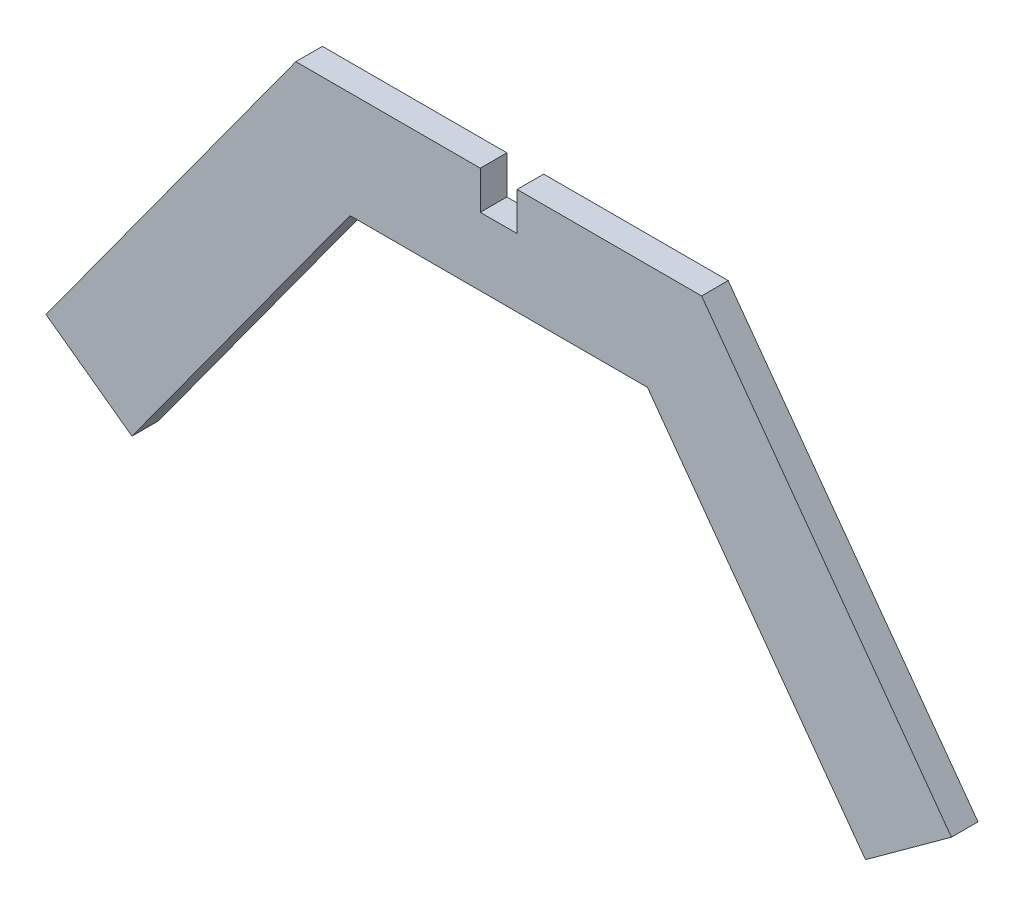
ISO-10303-21;
HEADER;
FILE_DESCRIPTION(('STEP AP214'),'2;1');
FILE_NAME('part.step','',(''),(''),'','','');
FILE_SCHEMA(('AUTOMOTIVE_DESIGN { 1 0 10303 214 1 1 1 1 }'));
ENDSEC;
DATA;
#1=APPLICATION_CONTEXT('core data for automotive mechanical design processes');
#2=APPLICATION_PROTOCOL_DEFINITION('international standard','automotive_design',2000,#1);
#3=PRODUCT_CONTEXT('',#1,'mechanical');
#4=PRODUCT('Part','Part','',(#3));
#5=PRODUCT_RELATED_PRODUCT_CATEGORY('part','',(#4));
#6=PRODUCT_DEFINITION_FORMATION('','',#4);
#7=PRODUCT_DEFINITION_CONTEXT('part definition',#1,'design');
#8=PRODUCT_DEFINITION('design','',#6,#7);
#9=PRODUCT_DEFINITION_SHAPE('','',#8);
#10=(LENGTH_UNIT() NAMED_UNIT(*) SI_UNIT(.MILLI.,.METRE.));
#11=(NAMED_UNIT(*) PLANE_ANGLE_UNIT() SI_UNIT($,.RADIAN.));
#12=(NAMED_UNIT(*) SI_UNIT($,.STERADIAN.) SOLID_ANGLE_UNIT());
#13=UNCERTAINTY_MEASURE_WITH_UNIT(LENGTH_MEASURE(1.E-05),#10,'distance_accuracy_value','');
#14=(GEOMETRIC_REPRESENTATION_CONTEXT(3) GLOBAL_UNCERTAINTY_ASSIGNED_CONTEXT((#13)) GLOBAL_UNIT_ASSIGNED_CONTEXT((#10,
#11,#12)) REPRESENTATION_CONTEXT('',''));
#15=CARTESIAN_POINT('',(0.,0.,0.));
#16=DIRECTION('',(0.,0.,1.));
#17=DIRECTION('',(1.,0.,0.));
#18=AXIS2_PLACEMENT_3D('',#15,#16,#17);
#19=CARTESIAN_POINT('',(36.3764598128688,0.,4.7625));
#20=DIRECTION('',(0.,-1.,0.));
#21=DIRECTION('',(0.,0.,-1.));
#22=AXIS2_PLACEMENT_3D('',#19,#20,#21);
#23=PLANE('',#22);
#24=DIRECTION('',(-1.,0.,0.));
#25=VECTOR('',#24,1.);
#26=CARTESIAN_POINT('',(36.3764598128688,0.,0.));
#27=LINE('',#26,#25);
#28=CARTESIAN_POINT('',(36.3764598128688,0.,0.));
#29=VERTEX_POINT('',#28);
#30=CARTESIAN_POINT('',(3.302,0.,0.));
#31=VERTEX_POINT('',#30);
#32=EDGE_CURVE('E155',#29,#31,#27,.T.);
#33=ORIENTED_EDGE('',*,*,#32,.T.);
#34=DIRECTION('',(0.,0.,1.));
#35=VECTOR('',#34,1.);
#36=CARTESIAN_POINT('',(3.302,0.,0.));
#37=LINE('',#36,#35);
#38=CARTESIAN_POINT('',(3.302,0.,4.7625));
#39=VERTEX_POINT('',#38);
#40=EDGE_CURVE('E193',#31,#39,#37,.T.);
#41=ORIENTED_EDGE('',*,*,#40,.T.);
#42=DIRECTION('',(-1.,0.,0.));
#43=VECTOR('',#42,1.);
#44=CARTESIAN_POINT('',(36.3764598128688,0.,4.7625));
#45=LINE('',#44,#43);
#46=CARTESIAN_POINT('',(36.3764598128688,0.,4.7625));
#47=VERTEX_POINT('',#46);
#48=EDGE_CURVE('E237',#47,#39,#45,.T.);
#49=ORIENTED_EDGE('',*,*,#48,.F.);
#50=DIRECTION('',(0.,0.,-1.));
#51=VECTOR('',#50,1.);
#52=CARTESIAN_POINT('',(36.3764598128688,0.,4.7625));
#53=LINE('',#52,#51);
#54=EDGE_CURVE('E171',#47,#29,#53,.T.);
#55=ORIENTED_EDGE('',*,*,#54,.T.);
#56=EDGE_LOOP('',(#33,#41,#49,#55));
#57=FACE_BOUND('',#56,.T.);
#58=ADVANCED_FACE('F36',(#57),#23,.F.);
#59=CARTESIAN_POINT('',(65.7539222947129,-72.8444040275425,4.7625));
#60=DIRECTION('',(0.809016994374945,0.587785252292477,0.));
#61=DIRECTION('',(-0.587785252292477,0.809016994374945,0.));
#62=AXIS2_PLACEMENT_3D('',#59,#60,#61);
#63=PLANE('',#62);
#64=DIRECTION('',(0.587785252292477,-0.809016994374945,0.));
#65=VECTOR('',#64,1.);
#66=CARTESIAN_POINT('',(65.7539222947129,-72.8444040275425,0.));
#67=LINE('',#66,#65);
#68=CARTESIAN_POINT('',(26.67,-19.05,0.));
#69=VERTEX_POINT('',#68);
#70=CARTESIAN_POINT('',(65.7539222947129,-72.8444040275425,0.));
#71=VERTEX_POINT('',#70);
#72=EDGE_CURVE('E146',#69,#71,#67,.T.);
#73=ORIENTED_EDGE('',*,*,#72,.T.);
#74=DIRECTION('',(0.,0.,-1.));
#75=VECTOR('',#74,1.);
#76=CARTESIAN_POINT('',(65.7539222947129,-72.8444040275425,4.7625));
#77=LINE('',#76,#75);
#78=CARTESIAN_POINT('',(65.7539222947129,-72.8444040275425,4.7625));
#79=VERTEX_POINT('',#78);
#80=EDGE_CURVE('E11',#79,#71,#77,.T.);
#81=ORIENTED_EDGE('',*,*,#80,.F.);
#82=DIRECTION('',(0.587785252292477,-0.809016994374945,0.));
#83=VECTOR('',#82,1.);
#84=CARTESIAN_POINT('',(65.7539222947129,-72.8444040275425,4.7625));
#85=LINE('',#84,#83);
#86=CARTESIAN_POINT('',(26.67,-19.05,4.7625));
#87=VERTEX_POINT('',#86);
#88=EDGE_CURVE('E164',#87,#79,#85,.T.);
#89=ORIENTED_EDGE('',*,*,#88,.F.);
#90=DIRECTION('',(0.,0.,-1.));
#91=VECTOR('',#90,1.);
#92=CARTESIAN_POINT('',(26.67,-19.05,4.7625));
#93=LINE('',#92,#91);
#94=EDGE_CURVE('E142',#87,#69,#93,.T.);
#95=ORIENTED_EDGE('',*,*,#94,.T.);
#96=EDGE_LOOP('',(#73,#81,#89,#95));
#97=FACE_BOUND('',#96,.T.);
#98=ADVANCED_FACE('F38',(#97),#63,.F.);
#99=CARTESIAN_POINT('',(81.1656960375556,-61.6470949713708,4.7625));
#100=DIRECTION('',(-0.587785252292477,0.809016994374945,0.));
#101=DIRECTION('',(-0.809016994374945,-0.587785252292477,0.));
#102=AXIS2_PLACEMENT_3D('',#99,#100,#101);
#103=PLANE('',#102);
#104=DIRECTION('',(0.809016994374945,0.587785252292477,0.));
#105=VECTOR('',#104,1.);
#106=CARTESIAN_POINT('',(81.1656960375556,-61.6470949713708,0.));
#107=LINE('',#106,#105);
#108=CARTESIAN_POINT('',(81.1656960375556,-61.6470949713708,0.));
#109=VERTEX_POINT('',#108);
#110=EDGE_CURVE('E149',#71,#109,#107,.T.);
#111=ORIENTED_EDGE('',*,*,#110,.T.);
#112=DIRECTION('',(0.,0.,-1.));
#113=VECTOR('',#112,1.);
#114=CARTESIAN_POINT('',(81.1656960375556,-61.6470949713708,4.7625));
#115=LINE('',#114,#113);
#116=CARTESIAN_POINT('',(81.1656960375556,-61.6470949713708,4.7625));
#117=VERTEX_POINT('',#116);
#118=EDGE_CURVE('E44',#117,#109,#115,.T.);
#119=ORIENTED_EDGE('',*,*,#118,.F.);
#120=DIRECTION('',(0.809016994374945,0.587785252292477,0.));
#121=VECTOR('',#120,1.);
#122=CARTESIAN_POINT('',(81.1656960375556,-61.6470949713708,4.7625));
#123=LINE('',#122,#121);
#124=EDGE_CURVE('E101',#79,#117,#123,.T.);
#125=ORIENTED_EDGE('',*,*,#124,.F.);
#126=ORIENTED_EDGE('',*,*,#80,.T.);
#127=EDGE_LOOP('',(#111,#119,#125,#126));
#128=FACE_BOUND('',#127,.T.);
#129=ADVANCED_FACE('F249',(#128),#103,.F.);
#130=CARTESIAN_POINT('',(36.3764598128688,0.,4.7625));
#131=DIRECTION('',(-0.809016994374945,-0.587785252292477,0.));
#132=DIRECTION('',(0.587785252292477,-0.809016994374945,0.));
#133=AXIS2_PLACEMENT_3D('',#130,#131,#132);
#134=PLANE('',#133);
#135=DIRECTION('',(-0.587785252292477,0.809016994374945,0.));
#136=VECTOR('',#135,1.);
#137=CARTESIAN_POINT('',(36.3764598128688,0.,0.));
#138=LINE('',#137,#136);
#139=EDGE_CURVE('E152',#109,#29,#138,.T.);
#140=ORIENTED_EDGE('',*,*,#139,.T.);
#141=ORIENTED_EDGE('',*,*,#54,.F.);
#142=DIRECTION('',(-0.587785252292477,0.809016994374945,0.));
#143=VECTOR('',#142,1.);
#144=CARTESIAN_POINT('',(36.3764598128688,0.,4.7625));
#145=LINE('',#144,#143);
#146=EDGE_CURVE('E179',#117,#47,#145,.T.);
#147=ORIENTED_EDGE('',*,*,#146,.F.);
#148=ORIENTED_EDGE('',*,*,#118,.T.);
#149=EDGE_LOOP('',(#140,#141,#147,#148));
#150=FACE_BOUND('',#149,.T.);
#151=ADVANCED_FACE('F177',(#150),#134,.F.);
#152=CARTESIAN_POINT('',(-3.302,0.,4.7625));
#153=VERTEX_POINT('',#152);
#154=CARTESIAN_POINT('',(-36.3764598128688,0.,4.7625));
#155=VERTEX_POINT('',#154);
#156=EDGE_CURVE('E236',#153,#155,#45,.T.);
#157=ORIENTED_EDGE('',*,*,#156,.F.);
#158=DIRECTION('',(0.,0.,1.));
#159=VECTOR('',#158,1.);
#160=CARTESIAN_POINT('',(-3.302,0.,0.));
#161=LINE('',#160,#159);
#162=CARTESIAN_POINT('',(-3.302,0.,0.));
#163=VERTEX_POINT('',#162);
#164=EDGE_CURVE('E216',#163,#153,#161,.T.);
#165=ORIENTED_EDGE('',*,*,#164,.F.);
#166=CARTESIAN_POINT('',(-36.3764598128688,0.,0.));
#167=VERTEX_POINT('',#166);
#168=EDGE_CURVE('E154',#163,#167,#27,.T.);
#169=ORIENTED_EDGE('',*,*,#168,.T.);
#170=DIRECTION('',(0.,0.,-1.));
#171=VECTOR('',#170,1.);
#172=CARTESIAN_POINT('',(-36.3764598128688,0.,4.7625));
#173=LINE('',#172,#171);
#174=EDGE_CURVE('E168',#155,#167,#173,.T.);
#175=ORIENTED_EDGE('',*,*,#174,.F.);
#176=EDGE_LOOP('',(#157,#165,#169,#175));
#177=FACE_BOUND('',#176,.T.);
#178=ADVANCED_FACE('F240',(#177),#23,.F.);
#179=CARTESIAN_POINT('',(-36.3764598128688,0.,4.7625));
#180=DIRECTION('',(0.809016994374945,-0.587785252292477,0.));
#181=DIRECTION('',(0.587785252292477,0.809016994374945,0.));
#182=AXIS2_PLACEMENT_3D('',#179,#180,#181);
#183=PLANE('',#182);
#184=DIRECTION('',(-0.587785252292477,-0.809016994374945,0.));
#185=VECTOR('',#184,1.);
#186=CARTESIAN_POINT('',(-36.3764598128688,0.,0.));
#187=LINE('',#186,#185);
#188=CARTESIAN_POINT('',(-81.1656960375556,-61.6470949713708,0.));
#189=VERTEX_POINT('',#188);
#190=EDGE_CURVE('E158',#167,#189,#187,.T.);
#191=ORIENTED_EDGE('',*,*,#190,.T.);
#192=DIRECTION('',(0.,0.,-1.));
#193=VECTOR('',#192,1.);
#194=CARTESIAN_POINT('',(-81.1656960375556,-61.6470949713708,4.7625));
#195=LINE('',#194,#193);
#196=CARTESIAN_POINT('',(-81.1656960375556,-61.6470949713708,4.7625));
#197=VERTEX_POINT('',#196);
#198=EDGE_CURVE('E137',#197,#189,#195,.T.);
#199=ORIENTED_EDGE('',*,*,#198,.F.);
#200=DIRECTION('',(-0.587785252292477,-0.809016994374945,0.));
#201=VECTOR('',#200,1.);
#202=CARTESIAN_POINT('',(-36.3764598128688,0.,4.7625));
#203=LINE('',#202,#201);
#204=EDGE_CURVE('E125',#155,#197,#203,.T.);
#205=ORIENTED_EDGE('',*,*,#204,.F.);
#206=ORIENTED_EDGE('',*,*,#174,.T.);
#207=EDGE_LOOP('',(#191,#199,#205,#206));
#208=FACE_BOUND('',#207,.T.);
#209=ADVANCED_FACE('F244',(#208),#183,.F.);
#210=CARTESIAN_POINT('',(-81.1656960375556,-61.6470949713708,4.7625));
#211=DIRECTION('',(0.587785252292477,0.809016994374945,0.));
#212=DIRECTION('',(-0.809016994374945,0.587785252292477,0.));
#213=AXIS2_PLACEMENT_3D('',#210,#211,#212);
#214=PLANE('',#213);
#215=DIRECTION('',(0.809016994374945,-0.587785252292477,0.));
#216=VECTOR('',#215,1.);
#217=CARTESIAN_POINT('',(-81.1656960375556,-61.6470949713708,0.));
#218=LINE('',#217,#216);
#219=CARTESIAN_POINT('',(-65.7539222947129,-72.8444040275425,0.));
#220=VERTEX_POINT('',#219);
#221=EDGE_CURVE('E134',#189,#220,#218,.T.);
#222=ORIENTED_EDGE('',*,*,#221,.T.);
#223=DIRECTION('',(0.,0.,-1.));
#224=VECTOR('',#223,1.);
#225=CARTESIAN_POINT('',(-65.7539222947129,-72.8444040275425,4.7625));
#226=LINE('',#225,#224);
#227=CARTESIAN_POINT('',(-65.7539222947129,-72.8444040275425,4.7625));
#228=VERTEX_POINT('',#227);
#229=EDGE_CURVE('E131',#228,#220,#226,.T.);
#230=ORIENTED_EDGE('',*,*,#229,.F.);
#231=DIRECTION('',(0.809016994374945,-0.587785252292477,0.));
#232=VECTOR('',#231,1.);
#233=CARTESIAN_POINT('',(-81.1656960375556,-61.6470949713708,4.7625));
#234=LINE('',#233,#232);
#235=EDGE_CURVE('E117',#197,#228,#234,.T.);
#236=ORIENTED_EDGE('',*,*,#235,.F.);
#237=ORIENTED_EDGE('',*,*,#198,.T.);
#238=EDGE_LOOP('',(#222,#230,#236,#237));
#239=FACE_BOUND('',#238,.T.);
#240=ADVANCED_FACE('F132',(#239),#214,.F.);
#241=CARTESIAN_POINT('',(-65.7539222947129,-72.8444040275425,4.7625));
#242=DIRECTION('',(-0.809016994374945,0.587785252292477,0.));
#243=DIRECTION('',(-0.587785252292477,-0.809016994374945,0.));
#244=AXIS2_PLACEMENT_3D('',#241,#242,#243);
#245=PLANE('',#244);
#246=DIRECTION('',(0.587785252292477,0.809016994374945,0.));
#247=VECTOR('',#246,1.);
#248=CARTESIAN_POINT('',(-65.7539222947129,-72.8444040275425,0.));
#249=LINE('',#248,#247);
#250=CARTESIAN_POINT('',(-26.67,-19.05,0.));
#251=VERTEX_POINT('',#250);
#252=EDGE_CURVE('E161',#220,#251,#249,.T.);
#253=ORIENTED_EDGE('',*,*,#252,.T.);
#254=DIRECTION('',(0.,0.,-1.));
#255=VECTOR('',#254,1.);
#256=CARTESIAN_POINT('',(-26.67,-19.05,4.7625));
#257=LINE('',#256,#255);
#258=CARTESIAN_POINT('',(-26.67,-19.05,4.7625));
#259=VERTEX_POINT('',#258);
#260=EDGE_CURVE('E138',#259,#251,#257,.T.);
#261=ORIENTED_EDGE('',*,*,#260,.F.);
#262=DIRECTION('',(0.587785252292477,0.809016994374945,0.));
#263=VECTOR('',#262,1.);
#264=CARTESIAN_POINT('',(-65.7539222947129,-72.8444040275425,4.7625));
#265=LINE('',#264,#263);
#266=EDGE_CURVE('E122',#228,#259,#265,.T.);
#267=ORIENTED_EDGE('',*,*,#266,.F.);
#268=ORIENTED_EDGE('',*,*,#229,.T.);
#269=EDGE_LOOP('',(#253,#261,#267,#268));
#270=FACE_BOUND('',#269,.T.);
#271=ADVANCED_FACE('F140',(#270),#245,.F.);
#272=CARTESIAN_POINT('',(-26.67,-19.05,4.7625));
#273=DIRECTION('',(0.,1.,0.));
#274=DIRECTION('',(0.,0.,1.));
#275=AXIS2_PLACEMENT_3D('',#272,#273,#274);
#276=PLANE('',#275);
#277=DIRECTION('',(1.,0.,0.));
#278=VECTOR('',#277,1.);
#279=CARTESIAN_POINT('',(-26.67,-19.05,0.));
#280=LINE('',#279,#278);
#281=EDGE_CURVE('E93',#251,#69,#280,.T.);
#282=ORIENTED_EDGE('',*,*,#281,.T.);
#283=ORIENTED_EDGE('',*,*,#94,.F.);
#284=DIRECTION('',(1.,0.,0.));
#285=VECTOR('',#284,1.);
#286=CARTESIAN_POINT('',(-26.67,-19.05,4.7625));
#287=LINE('',#286,#285);
#288=EDGE_CURVE('E60',#259,#87,#287,.T.);
#289=ORIENTED_EDGE('',*,*,#288,.F.);
#290=ORIENTED_EDGE('',*,*,#260,.T.);
#291=EDGE_LOOP('',(#282,#283,#289,#290));
#292=FACE_BOUND('',#291,.T.);
#293=ADVANCED_FACE('F245',(#292),#276,.F.);
#294=CARTESIAN_POINT('',(0.,0.,4.7625));
#295=DIRECTION('',(0.,0.,1.));
#296=DIRECTION('',(1.,0.,0.));
#297=AXIS2_PLACEMENT_3D('',#294,#295,#296);
#298=PLANE('',#297);
#299=DIRECTION('',(0.,1.,0.));
#300=VECTOR('',#299,1.);
#301=CARTESIAN_POINT('',(3.302,0.,4.7625));
#302=LINE('',#301,#300);
#303=CARTESIAN_POINT('',(3.302,-6.85800000000001,4.7625));
#304=VERTEX_POINT('',#303);
#305=EDGE_CURVE('E223',#304,#39,#302,.T.);
#306=ORIENTED_EDGE('',*,*,#305,.F.);
#307=DIRECTION('',(1.,0.,0.));
#308=VECTOR('',#307,1.);
#309=CARTESIAN_POINT('',(-3.302,-6.85800000000001,4.7625));
#310=LINE('',#309,#308);
#311=CARTESIAN_POINT('',(-3.302,-6.85800000000001,4.7625));
#312=VERTEX_POINT('',#311);
#313=EDGE_CURVE('E213',#312,#304,#310,.T.);
#314=ORIENTED_EDGE('',*,*,#313,.F.);
#315=DIRECTION('',(0.,-1.,0.));
#316=VECTOR('',#315,1.);
#317=CARTESIAN_POINT('',(-3.302,0.,4.7625));
#318=LINE('',#317,#316);
#319=EDGE_CURVE('E219',#153,#312,#318,.T.);
#320=ORIENTED_EDGE('',*,*,#319,.F.);
#321=ORIENTED_EDGE('',*,*,#156,.T.);
#322=ORIENTED_EDGE('',*,*,#204,.T.);
#323=ORIENTED_EDGE('',*,*,#235,.T.);
#324=ORIENTED_EDGE('',*,*,#266,.T.);
#325=ORIENTED_EDGE('',*,*,#288,.T.);
#326=ORIENTED_EDGE('',*,*,#88,.T.);
#327=ORIENTED_EDGE('',*,*,#124,.T.);
#328=ORIENTED_EDGE('',*,*,#146,.T.);
#329=ORIENTED_EDGE('',*,*,#48,.T.);
#330=EDGE_LOOP('',(#306,#314,#320,#321,#322,#323,#324,#325,#326,#327,#328,#329));
#331=FACE_BOUND('',#330,.T.);
#332=ADVANCED_FACE('F120',(#331),#298,.T.);
#333=CARTESIAN_POINT('',(0.,0.,0.));
#334=DIRECTION('',(0.,0.,1.));
#335=DIRECTION('',(1.,0.,0.));
#336=AXIS2_PLACEMENT_3D('',#333,#334,#335);
#337=PLANE('',#336);
#338=DIRECTION('',(1.,0.,0.));
#339=VECTOR('',#338,1.);
#340=CARTESIAN_POINT('',(-3.302,-6.85800000000001,0.));
#341=LINE('',#340,#339);
#342=CARTESIAN_POINT('',(-3.302,-6.85800000000001,0.));
#343=VERTEX_POINT('',#342);
#344=CARTESIAN_POINT('',(3.302,-6.85800000000001,0.));
#345=VERTEX_POINT('',#344);
#346=EDGE_CURVE('E51',#343,#345,#341,.T.);
#347=ORIENTED_EDGE('',*,*,#346,.T.);
#348=DIRECTION('',(0.,1.,0.));
#349=VECTOR('',#348,1.);
#350=CARTESIAN_POINT('',(3.302,0.,0.));
#351=LINE('',#350,#349);
#352=EDGE_CURVE('E187',#345,#31,#351,.T.);
#353=ORIENTED_EDGE('',*,*,#352,.T.);
#354=ORIENTED_EDGE('',*,*,#32,.F.);
#355=ORIENTED_EDGE('',*,*,#139,.F.);
#356=ORIENTED_EDGE('',*,*,#110,.F.);
#357=ORIENTED_EDGE('',*,*,#72,.F.);
#358=ORIENTED_EDGE('',*,*,#281,.F.);
#359=ORIENTED_EDGE('',*,*,#252,.F.);
#360=ORIENTED_EDGE('',*,*,#221,.F.);
#361=ORIENTED_EDGE('',*,*,#190,.F.);
#362=ORIENTED_EDGE('',*,*,#168,.F.);
#363=DIRECTION('',(0.,-1.,0.));
#364=VECTOR('',#363,1.);
#365=CARTESIAN_POINT('',(-3.302,0.,0.));
#366=LINE('',#365,#364);
#367=EDGE_CURVE('E226',#163,#343,#366,.T.);
#368=ORIENTED_EDGE('',*,*,#367,.T.);
#369=EDGE_LOOP('',(#347,#353,#354,#355,#356,#357,#358,#359,#360,#361,#362,#368));
#370=FACE_BOUND('',#369,.T.);
#371=ADVANCED_FACE('F182',(#370),#337,.F.);
#372=CARTESIAN_POINT('',(3.302,0.,0.));
#373=DIRECTION('',(1.,0.,0.));
#374=DIRECTION('',(0.,1.,0.));
#375=AXIS2_PLACEMENT_3D('',#372,#373,#374);
#376=PLANE('',#375);
#377=ORIENTED_EDGE('',*,*,#305,.T.);
#378=ORIENTED_EDGE('',*,*,#40,.F.);
#379=ORIENTED_EDGE('',*,*,#352,.F.);
#380=DIRECTION('',(0.,0.,1.));
#381=VECTOR('',#380,1.);
#382=CARTESIAN_POINT('',(3.302,-6.85800000000001,0.));
#383=LINE('',#382,#381);
#384=EDGE_CURVE('E150',#345,#304,#383,.T.);
#385=ORIENTED_EDGE('',*,*,#384,.T.);
#386=EDGE_LOOP('',(#377,#378,#379,#385));
#387=FACE_BOUND('',#386,.T.);
#388=ADVANCED_FACE('F276',(#387),#376,.F.);
#389=CARTESIAN_POINT('',(-3.302,-6.85800000000001,0.));
#390=DIRECTION('',(0.,-1.,0.));
#391=DIRECTION('',(1.,0.,0.));
#392=AXIS2_PLACEMENT_3D('',#389,#390,#391);
#393=PLANE('',#392);
#394=ORIENTED_EDGE('',*,*,#313,.T.);
#395=ORIENTED_EDGE('',*,*,#384,.F.);
#396=ORIENTED_EDGE('',*,*,#346,.F.);
#397=DIRECTION('',(0.,0.,1.));
#398=VECTOR('',#397,1.);
#399=CARTESIAN_POINT('',(-3.302,-6.85800000000001,0.));
#400=LINE('',#399,#398);
#401=EDGE_CURVE('E209',#343,#312,#400,.T.);
#402=ORIENTED_EDGE('',*,*,#401,.T.);
#403=EDGE_LOOP('',(#394,#395,#396,#402));
#404=FACE_BOUND('',#403,.T.);
#405=ADVANCED_FACE('F211',(#404),#393,.F.);
#406=CARTESIAN_POINT('',(-3.302,0.,0.));
#407=DIRECTION('',(-1.,0.,0.));
#408=DIRECTION('',(0.,-1.,0.));
#409=AXIS2_PLACEMENT_3D('',#406,#407,#408);
#410=PLANE('',#409);
#411=ORIENTED_EDGE('',*,*,#319,.T.);
#412=ORIENTED_EDGE('',*,*,#401,.F.);
#413=ORIENTED_EDGE('',*,*,#367,.F.);
#414=ORIENTED_EDGE('',*,*,#164,.T.);
#415=EDGE_LOOP('',(#411,#412,#413,#414));
#416=FACE_BOUND('',#415,.T.);
#417=ADVANCED_FACE('F220',(#416),#410,.F.);
#418=CLOSED_SHELL('',(#58,#98,#129,#151,#178,#209,#240,#271,#293,#332,#371,#388,#405,#417));
#419=MANIFOLD_SOLID_BREP('B2',#418);
#420=ADVANCED_BREP_SHAPE_REPRESENTATION('',(#18,#419),#14);
#421=SHAPE_DEFINITION_REPRESENTATION(#9,#420);
ENDSEC;
END-ISO-10303-21;
